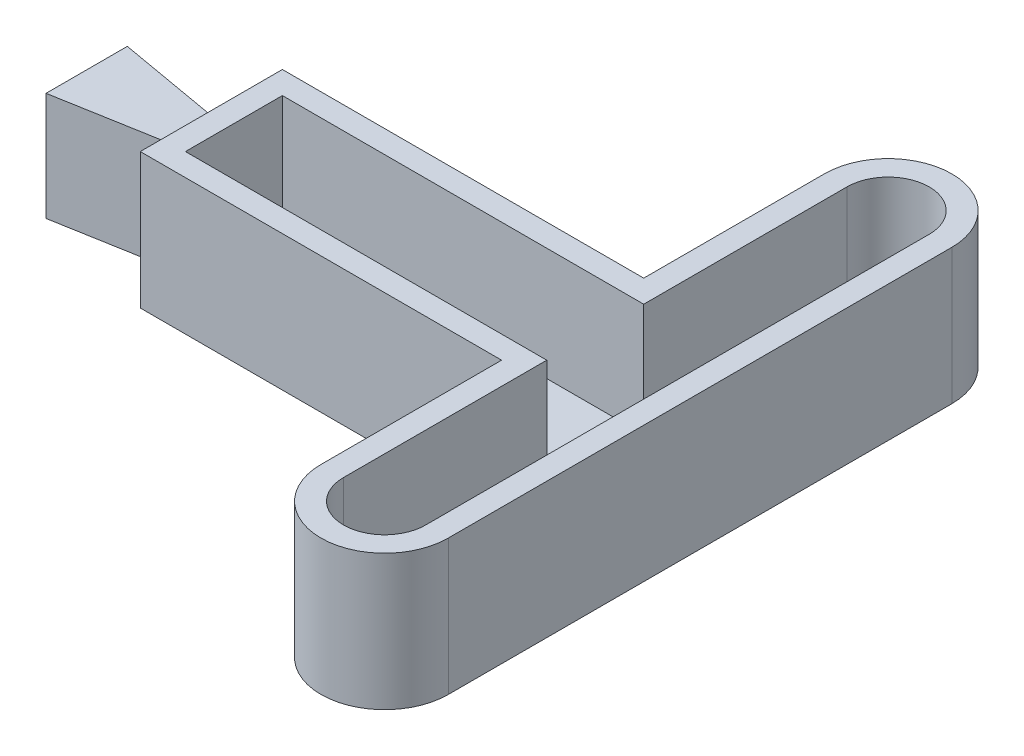
ISO-10303-21;
HEADER;
FILE_DESCRIPTION(('STEP AP214'),'2;1');
FILE_NAME('part.step','',(''),(''),'','','');
FILE_SCHEMA(('AUTOMOTIVE_DESIGN { 1 0 10303 214 1 1 1 1 }'));
ENDSEC;
DATA;
#1=APPLICATION_CONTEXT('core data for automotive mechanical design processes');
#2=APPLICATION_PROTOCOL_DEFINITION('international standard','automotive_design',2000,#1);
#3=PRODUCT_CONTEXT('',#1,'mechanical');
#4=PRODUCT('Part','Part','',(#3));
#5=PRODUCT_RELATED_PRODUCT_CATEGORY('part','',(#4));
#6=PRODUCT_DEFINITION_FORMATION('','',#4);
#7=PRODUCT_DEFINITION_CONTEXT('part definition',#1,'design');
#8=PRODUCT_DEFINITION('design','',#6,#7);
#9=PRODUCT_DEFINITION_SHAPE('','',#8);
#10=(LENGTH_UNIT() NAMED_UNIT(*) SI_UNIT(.MILLI.,.METRE.));
#11=(NAMED_UNIT(*) PLANE_ANGLE_UNIT() SI_UNIT($,.RADIAN.));
#12=(NAMED_UNIT(*) SI_UNIT($,.STERADIAN.) SOLID_ANGLE_UNIT());
#13=UNCERTAINTY_MEASURE_WITH_UNIT(LENGTH_MEASURE(1.E-05),#10,'distance_accuracy_value','');
#14=(GEOMETRIC_REPRESENTATION_CONTEXT(3) GLOBAL_UNCERTAINTY_ASSIGNED_CONTEXT((#13)) GLOBAL_UNIT_ASSIGNED_CONTEXT((#10,
#11,#12)) REPRESENTATION_CONTEXT('',''));
#15=CARTESIAN_POINT('',(0.,0.,0.));
#16=DIRECTION('',(0.,0.,1.));
#17=DIRECTION('',(1.,0.,0.));
#18=AXIS2_PLACEMENT_3D('',#15,#16,#17);
#19=CARTESIAN_POINT('',(0.,38.1,-11.43));
#20=DIRECTION('',(-0.173648177666928,0.,0.984807753012209));
#21=DIRECTION('',(0.984807753012209,0.,0.173648177666928));
#22=AXIS2_PLACEMENT_3D('',#19,#20,#21);
#23=PLANE('',#22);
#24=DIRECTION('',(0.,-1.,0.));
#25=VECTOR('',#24,1.);
#26=CARTESIAN_POINT('',(0.,38.1,-11.43));
#27=LINE('',#26,#25);
#28=CARTESIAN_POINT('',(0.,30.48,-11.43));
#29=VERTEX_POINT('',#28);
#30=CARTESIAN_POINT('',(0.,0.,-11.43));
#31=VERTEX_POINT('',#30);
#32=EDGE_CURVE('E11',#29,#31,#27,.T.);
#33=ORIENTED_EDGE('',*,*,#32,.F.);
#34=DIRECTION('',(0.984807753012209,0.,0.173648177666928));
#35=VECTOR('',#34,1.);
#36=CARTESIAN_POINT('',(0.,30.48,-11.43));
#37=LINE('',#36,#35);
#38=CARTESIAN_POINT('',(35.052,30.48,-5.24938667220698));
#39=VERTEX_POINT('',#38);
#40=EDGE_CURVE('E174',#29,#39,#37,.T.);
#41=ORIENTED_EDGE('',*,*,#40,.T.);
#42=DIRECTION('',(0.,-1.,0.));
#43=VECTOR('',#42,1.);
#44=CARTESIAN_POINT('',(35.052,38.1,-5.24938667220698));
#45=LINE('',#44,#43);
#46=CARTESIAN_POINT('',(35.052,0.,-5.24938667220698));
#47=VERTEX_POINT('',#46);
#48=EDGE_CURVE('E116',#39,#47,#45,.T.);
#49=ORIENTED_EDGE('',*,*,#48,.T.);
#50=DIRECTION('',(-0.984807753012208,0.,-0.173648177666928));
#51=VECTOR('',#50,1.);
#52=CARTESIAN_POINT('',(0.,0.,-11.43));
#53=LINE('',#52,#51);
#54=EDGE_CURVE('E170',#47,#31,#53,.T.);
#55=ORIENTED_EDGE('',*,*,#54,.T.);
#56=EDGE_LOOP('',(#33,#41,#49,#55));
#57=FACE_BOUND('',#56,.T.);
#58=ADVANCED_FACE('F46',(#57),#23,.F.);
#59=CARTESIAN_POINT('',(0.,38.1,-11.43));
#60=DIRECTION('',(1.,0.,0.));
#61=DIRECTION('',(0.,0.,-1.));
#62=AXIS2_PLACEMENT_3D('',#59,#60,#61);
#63=PLANE('',#62);
#64=DIRECTION('',(0.,-1.,0.));
#65=VECTOR('',#64,1.);
#66=CARTESIAN_POINT('',(0.,38.1,11.43));
#67=LINE('',#66,#65);
#68=CARTESIAN_POINT('',(0.,30.48,11.43));
#69=VERTEX_POINT('',#68);
#70=CARTESIAN_POINT('',(0.,0.,11.43));
#71=VERTEX_POINT('',#70);
#72=EDGE_CURVE('E54',#69,#71,#67,.T.);
#73=ORIENTED_EDGE('',*,*,#72,.F.);
#74=DIRECTION('',(0.,0.,1.));
#75=VECTOR('',#74,1.);
#76=CARTESIAN_POINT('',(0.,30.48,11.43));
#77=LINE('',#76,#75);
#78=EDGE_CURVE('E488',#29,#69,#77,.T.);
#79=ORIENTED_EDGE('',*,*,#78,.F.);
#80=ORIENTED_EDGE('',*,*,#32,.T.);
#81=DIRECTION('',(0.,0.,1.));
#82=VECTOR('',#81,1.);
#83=CARTESIAN_POINT('',(0.,0.,-11.43));
#84=LINE('',#83,#82);
#85=EDGE_CURVE('E173',#31,#71,#84,.T.);
#86=ORIENTED_EDGE('',*,*,#85,.T.);
#87=EDGE_LOOP('',(#73,#79,#80,#86));
#88=FACE_BOUND('',#87,.T.);
#89=ADVANCED_FACE('F248',(#88),#63,.F.);
#90=CARTESIAN_POINT('',(0.,38.1,11.43));
#91=DIRECTION('',(-0.173648177666928,0.,-0.984807753012208));
#92=DIRECTION('',(-0.984807753012209,0.,0.173648177666928));
#93=AXIS2_PLACEMENT_3D('',#90,#91,#92);
#94=PLANE('',#93);
#95=DIRECTION('',(0.,-1.,0.));
#96=VECTOR('',#95,1.);
#97=CARTESIAN_POINT('',(35.052,38.1,5.24938667220698));
#98=LINE('',#97,#96);
#99=CARTESIAN_POINT('',(35.052,30.48,5.24938667220698));
#100=VERTEX_POINT('',#99);
#101=CARTESIAN_POINT('',(35.052,0.,5.24938667220698));
#102=VERTEX_POINT('',#101);
#103=EDGE_CURVE('E233',#100,#102,#98,.T.);
#104=ORIENTED_EDGE('',*,*,#103,.F.);
#105=DIRECTION('',(0.984807753012208,0.,-0.173648177666928));
#106=VECTOR('',#105,1.);
#107=CARTESIAN_POINT('',(35.052,30.48,5.24938667220698));
#108=LINE('',#107,#106);
#109=EDGE_CURVE('E244',#69,#100,#108,.T.);
#110=ORIENTED_EDGE('',*,*,#109,.F.);
#111=ORIENTED_EDGE('',*,*,#72,.T.);
#112=DIRECTION('',(0.984807753012208,0.,-0.173648177666928));
#113=VECTOR('',#112,1.);
#114=CARTESIAN_POINT('',(0.,0.,11.43));
#115=LINE('',#114,#113);
#116=EDGE_CURVE('E178',#71,#102,#115,.T.);
#117=ORIENTED_EDGE('',*,*,#116,.T.);
#118=EDGE_LOOP('',(#104,#110,#111,#117));
#119=FACE_BOUND('',#118,.T.);
#120=ADVANCED_FACE('F240',(#119),#94,.F.);
#121=CARTESIAN_POINT('',(35.052,38.1,19.981386672207));
#122=DIRECTION('',(0.,0.,-1.));
#123=DIRECTION('',(-1.,0.,0.));
#124=AXIS2_PLACEMENT_3D('',#121,#122,#123);
#125=PLANE('',#124);
#126=DIRECTION('',(1.,0.,0.));
#127=VECTOR('',#126,1.);
#128=CARTESIAN_POINT('',(35.052,0.,19.981386672207));
#129=LINE('',#128,#127);
#130=CARTESIAN_POINT('',(35.052,0.,19.981386672207));
#131=VERTEX_POINT('',#130);
#132=CARTESIAN_POINT('',(136.652,0.,19.981386672207));
#133=VERTEX_POINT('',#132);
#134=EDGE_CURVE('E185',#131,#133,#129,.T.);
#135=ORIENTED_EDGE('',*,*,#134,.T.);
#136=DIRECTION('',(0.,-1.,0.));
#137=VECTOR('',#136,1.);
#138=CARTESIAN_POINT('',(136.652,38.1,19.981386672207));
#139=LINE('',#138,#137);
#140=CARTESIAN_POINT('',(136.652,38.1,19.981386672207));
#141=VERTEX_POINT('',#140);
#142=EDGE_CURVE('E225',#141,#133,#139,.T.);
#143=ORIENTED_EDGE('',*,*,#142,.F.);
#144=DIRECTION('',(1.,0.,0.));
#145=VECTOR('',#144,1.);
#146=CARTESIAN_POINT('',(35.052,38.1,19.981386672207));
#147=LINE('',#146,#145);
#148=CARTESIAN_POINT('',(35.052,38.1,19.981386672207));
#149=VERTEX_POINT('',#148);
#150=EDGE_CURVE('E261',#149,#141,#147,.T.);
#151=ORIENTED_EDGE('',*,*,#150,.F.);
#152=DIRECTION('',(0.,-1.,0.));
#153=VECTOR('',#152,1.);
#154=CARTESIAN_POINT('',(35.052,38.1,19.981386672207));
#155=LINE('',#154,#153);
#156=EDGE_CURVE('E229',#149,#131,#155,.T.);
#157=ORIENTED_EDGE('',*,*,#156,.T.);
#158=EDGE_LOOP('',(#135,#143,#151,#157));
#159=FACE_BOUND('',#158,.T.);
#160=ADVANCED_FACE('F259',(#159),#125,.F.);
#161=CARTESIAN_POINT('',(136.652,38.1,19.981386672207));
#162=DIRECTION('',(1.,0.,0.));
#163=DIRECTION('',(0.,0.,-1.));
#164=AXIS2_PLACEMENT_3D('',#161,#162,#163);
#165=PLANE('',#164);
#166=DIRECTION('',(0.,0.,1.));
#167=VECTOR('',#166,1.);
#168=CARTESIAN_POINT('',(136.652,0.,19.981386672207));
#169=LINE('',#168,#167);
#170=CARTESIAN_POINT('',(136.652,0.,70.781386672207));
#171=VERTEX_POINT('',#170);
#172=EDGE_CURVE('E188',#133,#171,#169,.T.);
#173=ORIENTED_EDGE('',*,*,#172,.T.);
#174=DIRECTION('',(0.,-1.,0.));
#175=VECTOR('',#174,1.);
#176=CARTESIAN_POINT('',(136.652,38.1,70.781386672207));
#177=LINE('',#176,#175);
#178=CARTESIAN_POINT('',(136.652,38.1,70.781386672207));
#179=VERTEX_POINT('',#178);
#180=EDGE_CURVE('E221',#179,#171,#177,.T.);
#181=ORIENTED_EDGE('',*,*,#180,.F.);
#182=DIRECTION('',(0.,0.,1.));
#183=VECTOR('',#182,1.);
#184=CARTESIAN_POINT('',(136.652,38.1,19.981386672207));
#185=LINE('',#184,#183);
#186=EDGE_CURVE('E264',#141,#179,#185,.T.);
#187=ORIENTED_EDGE('',*,*,#186,.F.);
#188=ORIENTED_EDGE('',*,*,#142,.T.);
#189=EDGE_LOOP('',(#173,#181,#187,#188));
#190=FACE_BOUND('',#189,.T.);
#191=ADVANCED_FACE('F518',(#190),#165,.F.);
#192=CARTESIAN_POINT('',(154.559,38.1,70.781386672207));
#193=DIRECTION('',(0.,-1.,0.));
#194=DIRECTION('',(0.,0.,-1.));
#195=AXIS2_PLACEMENT_3D('',#192,#193,#194);
#196=CYLINDRICAL_SURFACE('',#195,17.907);
#197=CARTESIAN_POINT('',(154.559,0.,70.781386672207));
#198=DIRECTION('',(0.,1.,0.));
#199=DIRECTION('',(0.,0.,-1.));
#200=AXIS2_PLACEMENT_3D('',#197,#198,#199);
#201=CIRCLE('',#200,17.907);
#202=CARTESIAN_POINT('',(172.466,0.,70.781386672207));
#203=VERTEX_POINT('',#202);
#204=EDGE_CURVE('E191',#171,#203,#201,.T.);
#205=ORIENTED_EDGE('',*,*,#204,.T.);
#206=DIRECTION('',(0.,-1.,0.));
#207=VECTOR('',#206,1.);
#208=CARTESIAN_POINT('',(172.466,38.1,70.781386672207));
#209=LINE('',#208,#207);
#210=CARTESIAN_POINT('',(172.466,38.1,70.781386672207));
#211=VERTEX_POINT('',#210);
#212=EDGE_CURVE('E217',#211,#203,#209,.T.);
#213=ORIENTED_EDGE('',*,*,#212,.F.);
#214=CARTESIAN_POINT('',(154.559,38.1,70.781386672207));
#215=DIRECTION('',(0.,1.,0.));
#216=DIRECTION('',(0.,0.,-1.));
#217=AXIS2_PLACEMENT_3D('',#214,#215,#216);
#218=CIRCLE('',#217,17.907);
#219=EDGE_CURVE('E268',#179,#211,#218,.T.);
#220=ORIENTED_EDGE('',*,*,#219,.F.);
#221=ORIENTED_EDGE('',*,*,#180,.T.);
#222=EDGE_LOOP('',(#205,#213,#220,#221));
#223=FACE_BOUND('',#222,.T.);
#224=ADVANCED_FACE('F279',(#223),#196,.T.);
#225=CARTESIAN_POINT('',(172.466,38.1,-70.781386672207));
#226=DIRECTION('',(-1.,0.,0.));
#227=DIRECTION('',(0.,0.,1.));
#228=AXIS2_PLACEMENT_3D('',#225,#226,#227);
#229=PLANE('',#228);
#230=DIRECTION('',(0.,0.,-1.));
#231=VECTOR('',#230,1.);
#232=CARTESIAN_POINT('',(172.466,0.,-70.781386672207));
#233=LINE('',#232,#231);
#234=CARTESIAN_POINT('',(172.466,0.,-70.781386672207));
#235=VERTEX_POINT('',#234);
#236=EDGE_CURVE('E194',#203,#235,#233,.T.);
#237=ORIENTED_EDGE('',*,*,#236,.T.);
#238=DIRECTION('',(0.,-1.,0.));
#239=VECTOR('',#238,1.);
#240=CARTESIAN_POINT('',(172.466,38.1,-70.781386672207));
#241=LINE('',#240,#239);
#242=CARTESIAN_POINT('',(172.466,38.1,-70.781386672207));
#243=VERTEX_POINT('',#242);
#244=EDGE_CURVE('E157',#243,#235,#241,.T.);
#245=ORIENTED_EDGE('',*,*,#244,.F.);
#246=DIRECTION('',(0.,0.,-1.));
#247=VECTOR('',#246,1.);
#248=CARTESIAN_POINT('',(172.466,38.1,-70.781386672207));
#249=LINE('',#248,#247);
#250=EDGE_CURVE('E143',#211,#243,#249,.T.);
#251=ORIENTED_EDGE('',*,*,#250,.F.);
#252=ORIENTED_EDGE('',*,*,#212,.T.);
#253=EDGE_LOOP('',(#237,#245,#251,#252));
#254=FACE_BOUND('',#253,.T.);
#255=ADVANCED_FACE('F283',(#254),#229,.F.);
#256=CARTESIAN_POINT('',(154.559,38.1,-70.781386672207));
#257=DIRECTION('',(0.,-1.,0.));
#258=DIRECTION('',(0.,0.,-1.));
#259=AXIS2_PLACEMENT_3D('',#256,#257,#258);
#260=CYLINDRICAL_SURFACE('',#259,17.907);
#261=CARTESIAN_POINT('',(154.559,0.,-70.781386672207));
#262=DIRECTION('',(0.,1.,0.));
#263=DIRECTION('',(0.,0.,1.));
#264=AXIS2_PLACEMENT_3D('',#261,#262,#263);
#265=CIRCLE('',#264,17.907);
#266=CARTESIAN_POINT('',(136.652,0.,-70.781386672207));
#267=VERTEX_POINT('',#266);
#268=EDGE_CURVE('E153',#235,#267,#265,.T.);
#269=ORIENTED_EDGE('',*,*,#268,.T.);
#270=DIRECTION('',(0.,-1.,0.));
#271=VECTOR('',#270,1.);
#272=CARTESIAN_POINT('',(136.652,38.1,-70.781386672207));
#273=LINE('',#272,#271);
#274=CARTESIAN_POINT('',(136.652,38.1,-70.781386672207));
#275=VERTEX_POINT('',#274);
#276=EDGE_CURVE('E150',#275,#267,#273,.T.);
#277=ORIENTED_EDGE('',*,*,#276,.F.);
#278=CARTESIAN_POINT('',(154.559,38.1,-70.781386672207));
#279=DIRECTION('',(0.,1.,0.));
#280=DIRECTION('',(0.,0.,1.));
#281=AXIS2_PLACEMENT_3D('',#278,#279,#280);
#282=CIRCLE('',#281,17.907);
#283=EDGE_CURVE('E136',#243,#275,#282,.T.);
#284=ORIENTED_EDGE('',*,*,#283,.F.);
#285=ORIENTED_EDGE('',*,*,#244,.T.);
#286=EDGE_LOOP('',(#269,#277,#284,#285));
#287=FACE_BOUND('',#286,.T.);
#288=ADVANCED_FACE('F151',(#287),#260,.T.);
#289=CARTESIAN_POINT('',(136.652,38.1,-19.981386672207));
#290=DIRECTION('',(1.,0.,0.));
#291=DIRECTION('',(0.,0.,-1.));
#292=AXIS2_PLACEMENT_3D('',#289,#290,#291);
#293=PLANE('',#292);
#294=DIRECTION('',(0.,0.,1.));
#295=VECTOR('',#294,1.);
#296=CARTESIAN_POINT('',(136.652,0.,-19.981386672207));
#297=LINE('',#296,#295);
#298=CARTESIAN_POINT('',(136.652,0.,-19.981386672207));
#299=VERTEX_POINT('',#298);
#300=EDGE_CURVE('E199',#267,#299,#297,.T.);
#301=ORIENTED_EDGE('',*,*,#300,.T.);
#302=DIRECTION('',(0.,-1.,0.));
#303=VECTOR('',#302,1.);
#304=CARTESIAN_POINT('',(136.652,38.1,-19.981386672207));
#305=LINE('',#304,#303);
#306=CARTESIAN_POINT('',(136.652,38.1,-19.981386672207));
#307=VERTEX_POINT('',#306);
#308=EDGE_CURVE('E158',#307,#299,#305,.T.);
#309=ORIENTED_EDGE('',*,*,#308,.F.);
#310=DIRECTION('',(0.,0.,1.));
#311=VECTOR('',#310,1.);
#312=CARTESIAN_POINT('',(136.652,38.1,-19.981386672207));
#313=LINE('',#312,#311);
#314=EDGE_CURVE('E140',#275,#307,#313,.T.);
#315=ORIENTED_EDGE('',*,*,#314,.F.);
#316=ORIENTED_EDGE('',*,*,#276,.T.);
#317=EDGE_LOOP('',(#301,#309,#315,#316));
#318=FACE_BOUND('',#317,.T.);
#319=ADVANCED_FACE('F160',(#318),#293,.F.);
#320=CARTESIAN_POINT('',(35.052,38.1,-19.981386672207));
#321=DIRECTION('',(0.,0.,1.));
#322=DIRECTION('',(1.,0.,0.));
#323=AXIS2_PLACEMENT_3D('',#320,#321,#322);
#324=PLANE('',#323);
#325=DIRECTION('',(-1.,0.,0.));
#326=VECTOR('',#325,1.);
#327=CARTESIAN_POINT('',(35.052,0.,-19.981386672207));
#328=LINE('',#327,#326);
#329=CARTESIAN_POINT('',(35.052,0.,-19.981386672207));
#330=VERTEX_POINT('',#329);
#331=EDGE_CURVE('E202',#299,#330,#328,.T.);
#332=ORIENTED_EDGE('',*,*,#331,.T.);
#333=DIRECTION('',(0.,-1.,0.));
#334=VECTOR('',#333,1.);
#335=CARTESIAN_POINT('',(35.052,38.1,-19.981386672207));
#336=LINE('',#335,#334);
#337=CARTESIAN_POINT('',(35.052,38.1,-19.981386672207));
#338=VERTEX_POINT('',#337);
#339=EDGE_CURVE('E210',#338,#330,#336,.T.);
#340=ORIENTED_EDGE('',*,*,#339,.F.);
#341=DIRECTION('',(-1.,0.,0.));
#342=VECTOR('',#341,1.);
#343=CARTESIAN_POINT('',(35.052,38.1,-19.981386672207));
#344=LINE('',#343,#342);
#345=EDGE_CURVE('E164',#307,#338,#344,.T.);
#346=ORIENTED_EDGE('',*,*,#345,.F.);
#347=ORIENTED_EDGE('',*,*,#308,.T.);
#348=EDGE_LOOP('',(#332,#340,#346,#347));
#349=FACE_BOUND('',#348,.T.);
#350=ADVANCED_FACE('F287',(#349),#324,.F.);
#351=CARTESIAN_POINT('',(35.052,38.1,-5.24938667220698));
#352=DIRECTION('',(1.,0.,0.));
#353=DIRECTION('',(0.,0.,-1.));
#354=AXIS2_PLACEMENT_3D('',#351,#352,#353);
#355=PLANE('',#354);
#356=DIRECTION('',(0.,0.,1.));
#357=VECTOR('',#356,1.);
#358=CARTESIAN_POINT('',(35.052,0.,-5.24938667220698));
#359=LINE('',#358,#357);
#360=EDGE_CURVE('E205',#330,#47,#359,.T.);
#361=ORIENTED_EDGE('',*,*,#360,.T.);
#362=ORIENTED_EDGE('',*,*,#48,.F.);
#363=DIRECTION('',(0.,0.,-1.));
#364=VECTOR('',#363,1.);
#365=CARTESIAN_POINT('',(35.052,30.48,-5.24938667220698));
#366=LINE('',#365,#364);
#367=EDGE_CURVE('E485',#100,#39,#366,.T.);
#368=ORIENTED_EDGE('',*,*,#367,.F.);
#369=ORIENTED_EDGE('',*,*,#103,.T.);
#370=DIRECTION('',(0.,0.,1.));
#371=VECTOR('',#370,1.);
#372=CARTESIAN_POINT('',(35.052,0.,5.24938667220698));
#373=LINE('',#372,#371);
#374=EDGE_CURVE('E182',#102,#131,#373,.T.);
#375=ORIENTED_EDGE('',*,*,#374,.T.);
#376=ORIENTED_EDGE('',*,*,#156,.F.);
#377=DIRECTION('',(0.,0.,1.));
#378=VECTOR('',#377,1.);
#379=CARTESIAN_POINT('',(35.052,38.1,5.24938667220698));
#380=LINE('',#379,#378);
#381=EDGE_CURVE('E70',#338,#149,#380,.T.);
#382=ORIENTED_EDGE('',*,*,#381,.F.);
#383=ORIENTED_EDGE('',*,*,#339,.T.);
#384=EDGE_LOOP('',(#361,#362,#368,#369,#375,#376,#382,#383));
#385=FACE_BOUND('',#384,.T.);
#386=ADVANCED_FACE('F255',(#385),#355,.F.);
#387=CARTESIAN_POINT('',(154.559,38.1,-70.781386672207));
#388=DIRECTION('',(0.,1.,0.));
#389=DIRECTION('',(0.,0.,1.));
#390=AXIS2_PLACEMENT_3D('',#387,#388,#389);
#391=PLANE('',#390);
#392=DIRECTION('',(-1.,0.,0.));
#393=VECTOR('',#392,1.);
#394=CARTESIAN_POINT('',(35.052,38.1,-13.631386672207));
#395=LINE('',#394,#393);
#396=CARTESIAN_POINT('',(143.002,38.1,-13.631386672207));
#397=VERTEX_POINT('',#396);
#398=CARTESIAN_POINT('',(41.402,38.1,-13.631386672207));
#399=VERTEX_POINT('',#398);
#400=EDGE_CURVE('E419',#397,#399,#395,.T.);
#401=ORIENTED_EDGE('',*,*,#400,.F.);
#402=DIRECTION('',(0.,0.,1.));
#403=VECTOR('',#402,1.);
#404=CARTESIAN_POINT('',(143.002,38.1,-19.981386672207));
#405=LINE('',#404,#403);
#406=CARTESIAN_POINT('',(143.002,38.1,-70.781386672207));
#407=VERTEX_POINT('',#406);
#408=EDGE_CURVE('E476',#407,#397,#405,.T.);
#409=ORIENTED_EDGE('',*,*,#408,.F.);
#410=CARTESIAN_POINT('',(154.559,38.1,-70.781386672207));
#411=DIRECTION('',(0.,1.,0.));
#412=DIRECTION('',(0.,0.,1.));
#413=AXIS2_PLACEMENT_3D('',#410,#411,#412);
#414=CIRCLE('',#413,11.557);
#415=CARTESIAN_POINT('',(166.116,38.1,-70.781386672207));
#416=VERTEX_POINT('',#415);
#417=EDGE_CURVE('E473',#416,#407,#414,.T.);
#418=ORIENTED_EDGE('',*,*,#417,.F.);
#419=DIRECTION('',(0.,0.,-1.));
#420=VECTOR('',#419,1.);
#421=CARTESIAN_POINT('',(166.116,38.1,-70.781386672207));
#422=LINE('',#421,#420);
#423=CARTESIAN_POINT('',(166.116,38.1,70.781386672207));
#424=VERTEX_POINT('',#423);
#425=EDGE_CURVE('E470',#424,#416,#422,.T.);
#426=ORIENTED_EDGE('',*,*,#425,.F.);
#427=CARTESIAN_POINT('',(154.559,38.1,70.781386672207));
#428=DIRECTION('',(0.,1.,0.));
#429=DIRECTION('',(0.,0.,1.));
#430=AXIS2_PLACEMENT_3D('',#427,#428,#429);
#431=CIRCLE('',#430,11.557);
#432=CARTESIAN_POINT('',(143.002,38.1,70.781386672207));
#433=VERTEX_POINT('',#432);
#434=EDGE_CURVE('E467',#433,#424,#431,.T.);
#435=ORIENTED_EDGE('',*,*,#434,.F.);
#436=DIRECTION('',(0.,0.,1.));
#437=VECTOR('',#436,1.);
#438=CARTESIAN_POINT('',(143.002,38.1,19.981386672207));
#439=LINE('',#438,#437);
#440=CARTESIAN_POINT('',(143.002,38.1,13.631386672207));
#441=VERTEX_POINT('',#440);
#442=EDGE_CURVE('E464',#441,#433,#439,.T.);
#443=ORIENTED_EDGE('',*,*,#442,.F.);
#444=DIRECTION('',(1.,0.,0.));
#445=VECTOR('',#444,1.);
#446=CARTESIAN_POINT('',(35.052,38.1,13.631386672207));
#447=LINE('',#446,#445);
#448=CARTESIAN_POINT('',(41.402,38.1,13.631386672207));
#449=VERTEX_POINT('',#448);
#450=EDGE_CURVE('E461',#449,#441,#447,.T.);
#451=ORIENTED_EDGE('',*,*,#450,.F.);
#452=DIRECTION('',(0.,0.,1.));
#453=VECTOR('',#452,1.);
#454=CARTESIAN_POINT('',(41.402,38.1,-5.24938667220698));
#455=LINE('',#454,#453);
#456=EDGE_CURVE('E408',#399,#449,#455,.T.);
#457=ORIENTED_EDGE('',*,*,#456,.F.);
#458=EDGE_LOOP('',(#401,#409,#418,#426,#435,#443,#451,#457));
#459=FACE_BOUND('',#458,.T.);
#460=ORIENTED_EDGE('',*,*,#345,.T.);
#461=ORIENTED_EDGE('',*,*,#381,.T.);
#462=ORIENTED_EDGE('',*,*,#150,.T.);
#463=ORIENTED_EDGE('',*,*,#186,.T.);
#464=ORIENTED_EDGE('',*,*,#219,.T.);
#465=ORIENTED_EDGE('',*,*,#250,.T.);
#466=ORIENTED_EDGE('',*,*,#283,.T.);
#467=ORIENTED_EDGE('',*,*,#314,.T.);
#468=EDGE_LOOP('',(#460,#461,#462,#463,#464,#465,#466,#467));
#469=FACE_BOUND('',#468,.T.);
#470=ADVANCED_FACE('F138',(#459,#469),#391,.T.);
#471=CARTESIAN_POINT('',(154.559,0.,-70.781386672207));
#472=DIRECTION('',(0.,1.,0.));
#473=DIRECTION('',(0.,0.,1.));
#474=AXIS2_PLACEMENT_3D('',#471,#472,#473);
#475=PLANE('',#474);
#476=ORIENTED_EDGE('',*,*,#54,.F.);
#477=ORIENTED_EDGE('',*,*,#360,.F.);
#478=ORIENTED_EDGE('',*,*,#331,.F.);
#479=ORIENTED_EDGE('',*,*,#300,.F.);
#480=ORIENTED_EDGE('',*,*,#268,.F.);
#481=ORIENTED_EDGE('',*,*,#236,.F.);
#482=ORIENTED_EDGE('',*,*,#204,.F.);
#483=ORIENTED_EDGE('',*,*,#172,.F.);
#484=ORIENTED_EDGE('',*,*,#134,.F.);
#485=ORIENTED_EDGE('',*,*,#374,.F.);
#486=ORIENTED_EDGE('',*,*,#116,.F.);
#487=ORIENTED_EDGE('',*,*,#85,.F.);
#488=EDGE_LOOP('',(#476,#477,#478,#479,#480,#481,#482,#483,#484,#485,#486,#487));
#489=FACE_BOUND('',#488,.T.);
#490=ADVANCED_FACE('F252',(#489),#475,.F.);
#491=CARTESIAN_POINT('',(0.,30.48,0.));
#492=DIRECTION('',(0.,-1.,0.));
#493=DIRECTION('',(0.,0.,-1.));
#494=AXIS2_PLACEMENT_3D('',#491,#492,#493);
#495=PLANE('',#494);
#496=ORIENTED_EDGE('',*,*,#78,.T.);
#497=ORIENTED_EDGE('',*,*,#109,.T.);
#498=ORIENTED_EDGE('',*,*,#367,.T.);
#499=ORIENTED_EDGE('',*,*,#40,.F.);
#500=EDGE_LOOP('',(#496,#497,#498,#499));
#501=FACE_BOUND('',#500,.T.);
#502=ADVANCED_FACE('F491',(#501),#495,.F.);
#503=CARTESIAN_POINT('',(41.402,38.1,-5.24938667220698));
#504=DIRECTION('',(1.,0.,0.));
#505=DIRECTION('',(0.,0.,-1.));
#506=AXIS2_PLACEMENT_3D('',#503,#504,#505);
#507=PLANE('',#506);
#508=DIRECTION('',(0.,0.,1.));
#509=VECTOR('',#508,1.);
#510=CARTESIAN_POINT('',(41.402,6.35,-5.24938667220698));
#511=LINE('',#510,#509);
#512=CARTESIAN_POINT('',(41.402,6.35,-13.631386672207));
#513=VERTEX_POINT('',#512);
#514=CARTESIAN_POINT('',(41.402,6.35,13.631386672207));
#515=VERTEX_POINT('',#514);
#516=EDGE_CURVE('E405',#513,#515,#511,.T.);
#517=ORIENTED_EDGE('',*,*,#516,.F.);
#518=DIRECTION('',(0.,-1.,0.));
#519=VECTOR('',#518,1.);
#520=CARTESIAN_POINT('',(41.402,38.1,-13.631386672207));
#521=LINE('',#520,#519);
#522=EDGE_CURVE('E414',#399,#513,#521,.T.);
#523=ORIENTED_EDGE('',*,*,#522,.F.);
#524=ORIENTED_EDGE('',*,*,#456,.T.);
#525=DIRECTION('',(0.,-1.,0.));
#526=VECTOR('',#525,1.);
#527=CARTESIAN_POINT('',(41.402,38.1,13.631386672207));
#528=LINE('',#527,#526);
#529=EDGE_CURVE('E395',#449,#515,#528,.T.);
#530=ORIENTED_EDGE('',*,*,#529,.T.);
#531=EDGE_LOOP('',(#517,#523,#524,#530));
#532=FACE_BOUND('',#531,.T.);
#533=ADVANCED_FACE('F493',(#532),#507,.T.);
#534=CARTESIAN_POINT('',(35.052,38.1,-13.631386672207));
#535=DIRECTION('',(0.,0.,1.));
#536=DIRECTION('',(1.,0.,0.));
#537=AXIS2_PLACEMENT_3D('',#534,#535,#536);
#538=PLANE('',#537);
#539=DIRECTION('',(-1.,0.,0.));
#540=VECTOR('',#539,1.);
#541=CARTESIAN_POINT('',(35.052,6.35,-13.631386672207));
#542=LINE('',#541,#540);
#543=CARTESIAN_POINT('',(143.002,6.35,-13.631386672207));
#544=VERTEX_POINT('',#543);
#545=EDGE_CURVE('E409',#544,#513,#542,.T.);
#546=ORIENTED_EDGE('',*,*,#545,.F.);
#547=DIRECTION('',(0.,-1.,0.));
#548=VECTOR('',#547,1.);
#549=CARTESIAN_POINT('',(143.002,38.1,-13.631386672207));
#550=LINE('',#549,#548);
#551=EDGE_CURVE('E418',#397,#544,#550,.T.);
#552=ORIENTED_EDGE('',*,*,#551,.F.);
#553=ORIENTED_EDGE('',*,*,#400,.T.);
#554=ORIENTED_EDGE('',*,*,#522,.T.);
#555=EDGE_LOOP('',(#546,#552,#553,#554));
#556=FACE_BOUND('',#555,.T.);
#557=ADVANCED_FACE('F500',(#556),#538,.T.);
#558=CARTESIAN_POINT('',(143.002,38.1,-19.981386672207));
#559=DIRECTION('',(1.,0.,0.));
#560=DIRECTION('',(0.,0.,-1.));
#561=AXIS2_PLACEMENT_3D('',#558,#559,#560);
#562=PLANE('',#561);
#563=DIRECTION('',(0.,0.,1.));
#564=VECTOR('',#563,1.);
#565=CARTESIAN_POINT('',(143.002,6.35,-19.981386672207));
#566=LINE('',#565,#564);
#567=CARTESIAN_POINT('',(143.002,6.35,-70.781386672207));
#568=VERTEX_POINT('',#567);
#569=EDGE_CURVE('E449',#568,#544,#566,.T.);
#570=ORIENTED_EDGE('',*,*,#569,.F.);
#571=DIRECTION('',(0.,1.,0.));
#572=VECTOR('',#571,1.);
#573=CARTESIAN_POINT('',(143.002,38.1,-70.781386672207));
#574=LINE('',#573,#572);
#575=EDGE_CURVE('E61',#407,#568,#574,.F.);
#576=ORIENTED_EDGE('',*,*,#575,.F.);
#577=ORIENTED_EDGE('',*,*,#408,.T.);
#578=ORIENTED_EDGE('',*,*,#551,.T.);
#579=EDGE_LOOP('',(#570,#576,#577,#578));
#580=FACE_BOUND('',#579,.T.);
#581=ADVANCED_FACE('F550',(#580),#562,.T.);
#582=CARTESIAN_POINT('',(154.559,38.1,-70.781386672207));
#583=DIRECTION('',(0.,-1.,0.));
#584=DIRECTION('',(0.,0.,-1.));
#585=AXIS2_PLACEMENT_3D('',#582,#583,#584);
#586=CYLINDRICAL_SURFACE('',#585,11.557);
#587=CARTESIAN_POINT('',(154.559,6.35,-70.781386672207));
#588=DIRECTION('',(0.,1.,0.));
#589=DIRECTION('',(0.,0.,1.));
#590=AXIS2_PLACEMENT_3D('',#587,#588,#589);
#591=CIRCLE('',#590,11.557);
#592=CARTESIAN_POINT('',(166.116,6.35,-70.781386672207));
#593=VERTEX_POINT('',#592);
#594=EDGE_CURVE('E443',#593,#568,#591,.T.);
#595=ORIENTED_EDGE('',*,*,#594,.F.);
#596=DIRECTION('',(0.,-1.,0.));
#597=VECTOR('',#596,1.);
#598=CARTESIAN_POINT('',(166.116,38.1,-70.781386672207));
#599=LINE('',#598,#597);
#600=EDGE_CURVE('E440',#416,#593,#599,.T.);
#601=ORIENTED_EDGE('',*,*,#600,.F.);
#602=ORIENTED_EDGE('',*,*,#417,.T.);
#603=ORIENTED_EDGE('',*,*,#575,.T.);
#604=EDGE_LOOP('',(#595,#601,#602,#603));
#605=FACE_BOUND('',#604,.T.);
#606=ADVANCED_FACE('F552',(#605),#586,.F.);
#607=CARTESIAN_POINT('',(166.116,38.1,-70.781386672207));
#608=DIRECTION('',(-1.,0.,0.));
#609=DIRECTION('',(0.,0.,1.));
#610=AXIS2_PLACEMENT_3D('',#607,#608,#609);
#611=PLANE('',#610);
#612=DIRECTION('',(0.,0.,-1.));
#613=VECTOR('',#612,1.);
#614=CARTESIAN_POINT('',(166.116,6.35,-70.781386672207));
#615=LINE('',#614,#613);
#616=CARTESIAN_POINT('',(166.116,6.35,70.781386672207));
#617=VERTEX_POINT('',#616);
#618=EDGE_CURVE('E436',#617,#593,#615,.T.);
#619=ORIENTED_EDGE('',*,*,#618,.F.);
#620=DIRECTION('',(0.,1.,0.));
#621=VECTOR('',#620,1.);
#622=CARTESIAN_POINT('',(166.116,38.1,70.781386672207));
#623=LINE('',#622,#621);
#624=EDGE_CURVE('E433',#424,#617,#623,.F.);
#625=ORIENTED_EDGE('',*,*,#624,.F.);
#626=ORIENTED_EDGE('',*,*,#425,.T.);
#627=ORIENTED_EDGE('',*,*,#600,.T.);
#628=EDGE_LOOP('',(#619,#625,#626,#627));
#629=FACE_BOUND('',#628,.T.);
#630=ADVANCED_FACE('F558',(#629),#611,.T.);
#631=CARTESIAN_POINT('',(154.559,38.1,70.781386672207));
#632=DIRECTION('',(0.,-1.,0.));
#633=DIRECTION('',(0.,0.,-1.));
#634=AXIS2_PLACEMENT_3D('',#631,#632,#633);
#635=CYLINDRICAL_SURFACE('',#634,11.557);
#636=CARTESIAN_POINT('',(154.559,6.35,70.781386672207));
#637=DIRECTION('',(0.,1.,0.));
#638=DIRECTION('',(0.,0.,1.));
#639=AXIS2_PLACEMENT_3D('',#636,#637,#638);
#640=CIRCLE('',#639,11.557);
#641=CARTESIAN_POINT('',(143.002,6.35,70.781386672207));
#642=VERTEX_POINT('',#641);
#643=EDGE_CURVE('E429',#642,#617,#640,.T.);
#644=ORIENTED_EDGE('',*,*,#643,.F.);
#645=DIRECTION('',(0.,-1.,0.));
#646=VECTOR('',#645,1.);
#647=CARTESIAN_POINT('',(143.002,38.1,70.781386672207));
#648=LINE('',#647,#646);
#649=EDGE_CURVE('E426',#433,#642,#648,.T.);
#650=ORIENTED_EDGE('',*,*,#649,.F.);
#651=ORIENTED_EDGE('',*,*,#434,.T.);
#652=ORIENTED_EDGE('',*,*,#624,.T.);
#653=EDGE_LOOP('',(#644,#650,#651,#652));
#654=FACE_BOUND('',#653,.T.);
#655=ADVANCED_FACE('F591',(#654),#635,.F.);
#656=CARTESIAN_POINT('',(143.002,38.1,19.981386672207));
#657=DIRECTION('',(1.,0.,0.));
#658=DIRECTION('',(0.,0.,-1.));
#659=AXIS2_PLACEMENT_3D('',#656,#657,#658);
#660=PLANE('',#659);
#661=DIRECTION('',(0.,0.,1.));
#662=VECTOR('',#661,1.);
#663=CARTESIAN_POINT('',(143.002,6.35,19.981386672207));
#664=LINE('',#663,#662);
#665=CARTESIAN_POINT('',(143.002,6.35,13.631386672207));
#666=VERTEX_POINT('',#665);
#667=EDGE_CURVE('E422',#666,#642,#664,.T.);
#668=ORIENTED_EDGE('',*,*,#667,.F.);
#669=DIRECTION('',(0.,-1.,0.));
#670=VECTOR('',#669,1.);
#671=CARTESIAN_POINT('',(143.002,38.1,13.631386672207));
#672=LINE('',#671,#670);
#673=EDGE_CURVE('E413',#441,#666,#672,.T.);
#674=ORIENTED_EDGE('',*,*,#673,.F.);
#675=ORIENTED_EDGE('',*,*,#442,.T.);
#676=ORIENTED_EDGE('',*,*,#649,.T.);
#677=EDGE_LOOP('',(#668,#674,#675,#676));
#678=FACE_BOUND('',#677,.T.);
#679=ADVANCED_FACE('F587',(#678),#660,.T.);
#680=CARTESIAN_POINT('',(35.052,38.1,13.631386672207));
#681=DIRECTION('',(0.,0.,-1.));
#682=DIRECTION('',(-1.,0.,0.));
#683=AXIS2_PLACEMENT_3D('',#680,#681,#682);
#684=PLANE('',#683);
#685=DIRECTION('',(1.,0.,0.));
#686=VECTOR('',#685,1.);
#687=CARTESIAN_POINT('',(35.052,6.35,13.631386672207));
#688=LINE('',#687,#686);
#689=EDGE_CURVE('E404',#515,#666,#688,.T.);
#690=ORIENTED_EDGE('',*,*,#689,.F.);
#691=ORIENTED_EDGE('',*,*,#529,.F.);
#692=ORIENTED_EDGE('',*,*,#450,.T.);
#693=ORIENTED_EDGE('',*,*,#673,.T.);
#694=EDGE_LOOP('',(#690,#691,#692,#693));
#695=FACE_BOUND('',#694,.T.);
#696=ADVANCED_FACE('F584',(#695),#684,.T.);
#697=CARTESIAN_POINT('',(154.559,6.35,-70.781386672207));
#698=DIRECTION('',(0.,1.,0.));
#699=DIRECTION('',(0.,0.,1.));
#700=AXIS2_PLACEMENT_3D('',#697,#698,#699);
#701=PLANE('',#700);
#702=ORIENTED_EDGE('',*,*,#689,.T.);
#703=ORIENTED_EDGE('',*,*,#667,.T.);
#704=ORIENTED_EDGE('',*,*,#643,.T.);
#705=ORIENTED_EDGE('',*,*,#618,.T.);
#706=ORIENTED_EDGE('',*,*,#594,.T.);
#707=ORIENTED_EDGE('',*,*,#569,.T.);
#708=ORIENTED_EDGE('',*,*,#545,.T.);
#709=ORIENTED_EDGE('',*,*,#516,.T.);
#710=EDGE_LOOP('',(#702,#703,#704,#705,#706,#707,#708,#709));
#711=FACE_BOUND('',#710,.T.);
#712=ADVANCED_FACE('F548',(#711),#701,.T.);
#713=CLOSED_SHELL('',(#58,#89,#120,#160,#191,#224,#255,#288,#319,#350,#386,#470,#490,#502,#533,
#557,#581,#606,#630,#655,#679,#696,#712));
#714=CARTESIAN_POINT('',(-1.102665928185,38.1,-5.17647076837248));
#715=DIRECTION('',(-0.173648177666928,0.,0.984807753012209));
#716=DIRECTION('',(0.984807753012209,0.,0.173648177666928));
#717=AXIS2_PLACEMENT_3D('',#714,#715,#716);
#718=PLANE('',#717);
#719=DIRECTION('',(0.984807753012209,0.,0.173648177666928));
#720=VECTOR('',#719,1.);
#721=CARTESIAN_POINT('',(-1.102665928185,24.13,-5.17647076837248));
#722=LINE('',#721,#720);
#723=CARTESIAN_POINT('',(6.35,24.13,-3.86236468702679));
#724=VERTEX_POINT('',#723);
#725=CARTESIAN_POINT('',(28.2545586302688,24.13,0.));
#726=VERTEX_POINT('',#725);
#727=EDGE_CURVE('E369',#724,#726,#722,.T.);
#728=ORIENTED_EDGE('',*,*,#727,.F.);
#729=DIRECTION('',(0.,-1.,0.));
#730=VECTOR('',#729,1.);
#731=CARTESIAN_POINT('',(6.35,38.1,-3.86236468702679));
#732=LINE('',#731,#730);
#733=CARTESIAN_POINT('',(6.35,6.35,-3.86236468702679));
#734=VERTEX_POINT('',#733);
#735=EDGE_CURVE('E363',#724,#734,#732,.T.);
#736=ORIENTED_EDGE('',*,*,#735,.T.);
#737=DIRECTION('',(-0.984807753012209,0.,-0.173648177666928));
#738=VECTOR('',#737,1.);
#739=CARTESIAN_POINT('',(-1.102665928185,6.35,-5.17647076837248));
#740=LINE('',#739,#738);
#741=CARTESIAN_POINT('',(28.2545586302688,6.35,0.));
#742=VERTEX_POINT('',#741);
#743=EDGE_CURVE('E367',#742,#734,#740,.T.);
#744=ORIENTED_EDGE('',*,*,#743,.F.);
#745=DIRECTION('',(0.,-1.,0.));
#746=VECTOR('',#745,1.);
#747=CARTESIAN_POINT('',(28.2545586302688,38.1,0.));
#748=LINE('',#747,#746);
#749=EDGE_CURVE('E373',#726,#742,#748,.T.);
#750=ORIENTED_EDGE('',*,*,#749,.F.);
#751=EDGE_LOOP('',(#728,#736,#744,#750));
#752=FACE_BOUND('',#751,.T.);
#753=ADVANCED_FACE('F365',(#752),#718,.T.);
#754=CARTESIAN_POINT('',(6.34999999999999,38.1,-11.43));
#755=DIRECTION('',(1.,0.,0.));
#756=DIRECTION('',(0.,0.,-1.));
#757=AXIS2_PLACEMENT_3D('',#754,#755,#756);
#758=PLANE('',#757);
#759=DIRECTION('',(0.,-1.,0.));
#760=VECTOR('',#759,1.);
#761=CARTESIAN_POINT('',(6.35,38.1,3.86236468702679));
#762=LINE('',#761,#760);
#763=CARTESIAN_POINT('',(6.35,24.13,3.86236468702679));
#764=VERTEX_POINT('',#763);
#765=CARTESIAN_POINT('',(6.35,6.35,3.86236468702679));
#766=VERTEX_POINT('',#765);
#767=EDGE_CURVE('E374',#764,#766,#762,.T.);
#768=ORIENTED_EDGE('',*,*,#767,.T.);
#769=DIRECTION('',(0.,0.,1.));
#770=VECTOR('',#769,1.);
#771=CARTESIAN_POINT('',(6.34999999999999,6.35,-11.43));
#772=LINE('',#771,#770);
#773=EDGE_CURVE('E378',#734,#766,#772,.T.);
#774=ORIENTED_EDGE('',*,*,#773,.F.);
#775=ORIENTED_EDGE('',*,*,#735,.F.);
#776=DIRECTION('',(0.,0.,1.));
#777=VECTOR('',#776,1.);
#778=CARTESIAN_POINT('',(6.35,24.13,0.));
#779=LINE('',#778,#777);
#780=EDGE_CURVE('E390',#724,#764,#779,.T.);
#781=ORIENTED_EDGE('',*,*,#780,.T.);
#782=EDGE_LOOP('',(#768,#774,#775,#781));
#783=FACE_BOUND('',#782,.T.);
#784=ADVANCED_FACE('F379',(#783),#758,.T.);
#785=CARTESIAN_POINT('',(-1.10266592818499,38.1,5.17647076837248));
#786=DIRECTION('',(-0.173648177666928,0.,-0.984807753012208));
#787=DIRECTION('',(-0.984807753012209,0.,0.173648177666928));
#788=AXIS2_PLACEMENT_3D('',#785,#786,#787);
#789=PLANE('',#788);
#790=ORIENTED_EDGE('',*,*,#749,.T.);
#791=DIRECTION('',(0.984807753012209,0.,-0.173648177666928));
#792=VECTOR('',#791,1.);
#793=CARTESIAN_POINT('',(-1.10266592818499,6.35,5.17647076837248));
#794=LINE('',#793,#792);
#795=EDGE_CURVE('E384',#766,#742,#794,.T.);
#796=ORIENTED_EDGE('',*,*,#795,.F.);
#797=ORIENTED_EDGE('',*,*,#767,.F.);
#798=DIRECTION('',(0.984807753012209,0.,-0.173648177666928));
#799=VECTOR('',#798,1.);
#800=CARTESIAN_POINT('',(0.851979190921177,24.13,4.83181409616395));
#801=LINE('',#800,#799);
#802=EDGE_CURVE('E397',#764,#726,#801,.T.);
#803=ORIENTED_EDGE('',*,*,#802,.T.);
#804=EDGE_LOOP('',(#790,#796,#797,#803));
#805=FACE_BOUND('',#804,.T.);
#806=ADVANCED_FACE('F566',(#805),#789,.T.);
#807=ORIENTED_EDGE('',*,*,#743,.T.);
#808=ORIENTED_EDGE('',*,*,#773,.T.);
#809=ORIENTED_EDGE('',*,*,#795,.T.);
#810=EDGE_LOOP('',(#807,#808,#809));
#811=FACE_BOUND('',#810,.T.);
#812=ADVANCED_FACE('F386',(#811),#701,.T.);
#813=CARTESIAN_POINT('',(0.,24.13,0.));
#814=DIRECTION('',(0.,-1.,0.));
#815=DIRECTION('',(0.,0.,-1.));
#816=AXIS2_PLACEMENT_3D('',#813,#814,#815);
#817=PLANE('',#816);
#818=ORIENTED_EDGE('',*,*,#780,.F.);
#819=ORIENTED_EDGE('',*,*,#727,.T.);
#820=ORIENTED_EDGE('',*,*,#802,.F.);
#821=EDGE_LOOP('',(#818,#819,#820));
#822=FACE_BOUND('',#821,.T.);
#823=ADVANCED_FACE('F565',(#822),#817,.T.);
#824=CLOSED_SHELL('',(#753,#784,#806,#812,#823));
#825=ORIENTED_CLOSED_SHELL('',*,#824,.T.);
#826=BREP_WITH_VOIDS('B2',#713,(#825));
#827=ADVANCED_BREP_SHAPE_REPRESENTATION('',(#18,#826),#14);
#828=SHAPE_DEFINITION_REPRESENTATION(#9,#827);
ENDSEC;
END-ISO-10303-21;
